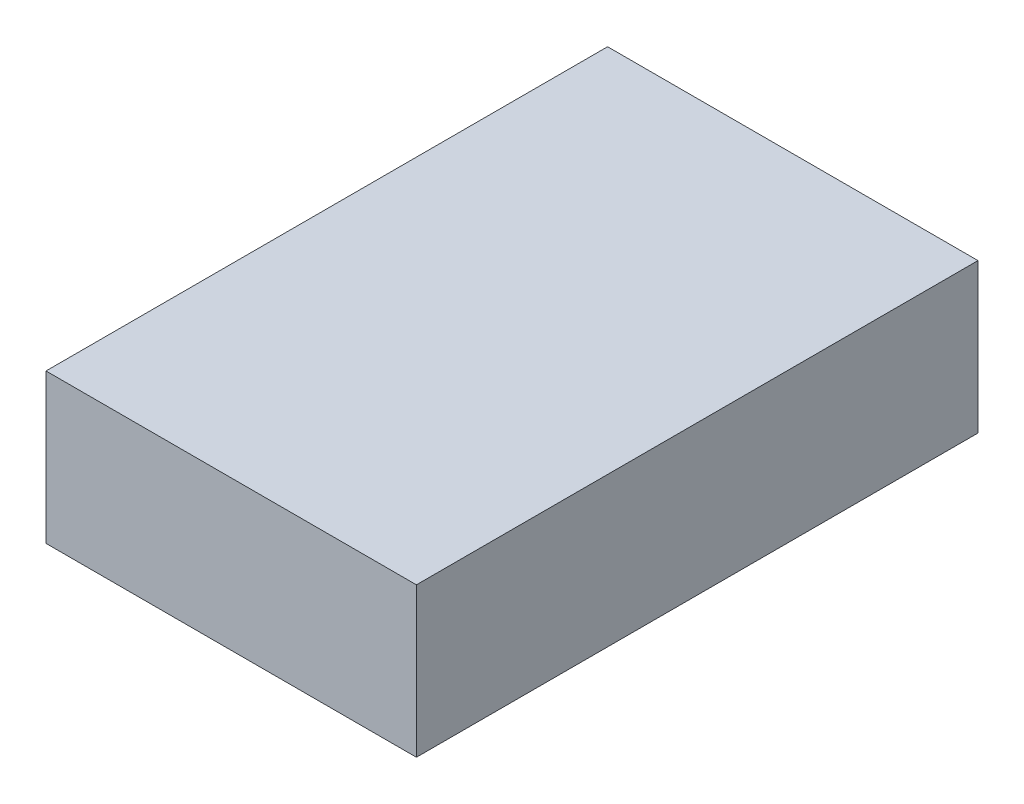
ISO-10303-21;
HEADER;
FILE_DESCRIPTION(('STEP AP214'),'2;1');
FILE_NAME('part.step','',(''),(''),'','','');
FILE_SCHEMA(('AUTOMOTIVE_DESIGN { 1 0 10303 214 1 1 1 1 }'));
ENDSEC;
DATA;
#1=APPLICATION_CONTEXT('core data for automotive mechanical design processes');
#2=APPLICATION_PROTOCOL_DEFINITION('international standard','automotive_design',2000,#1);
#3=PRODUCT_CONTEXT('',#1,'mechanical');
#4=PRODUCT('Part','Part','',(#3));
#5=PRODUCT_RELATED_PRODUCT_CATEGORY('part','',(#4));
#6=PRODUCT_DEFINITION_FORMATION('','',#4);
#7=PRODUCT_DEFINITION_CONTEXT('part definition',#1,'design');
#8=PRODUCT_DEFINITION('design','',#6,#7);
#9=PRODUCT_DEFINITION_SHAPE('','',#8);
#10=(LENGTH_UNIT() NAMED_UNIT(*) SI_UNIT(.MILLI.,.METRE.));
#11=(NAMED_UNIT(*) PLANE_ANGLE_UNIT() SI_UNIT($,.RADIAN.));
#12=(NAMED_UNIT(*) SI_UNIT($,.STERADIAN.) SOLID_ANGLE_UNIT());
#13=UNCERTAINTY_MEASURE_WITH_UNIT(LENGTH_MEASURE(1.E-05),#10,'distance_accuracy_value','');
#14=(GEOMETRIC_REPRESENTATION_CONTEXT(3) GLOBAL_UNCERTAINTY_ASSIGNED_CONTEXT((#13)) GLOBAL_UNIT_ASSIGNED_CONTEXT((#10,
#11,#12)) REPRESENTATION_CONTEXT('',''));
#15=CARTESIAN_POINT('',(0.,0.,0.));
#16=DIRECTION('',(0.,0.,1.));
#17=DIRECTION('',(1.,0.,0.));
#18=AXIS2_PLACEMENT_3D('',#15,#16,#17);
#19=CARTESIAN_POINT('',(31.,25.,47.));
#20=DIRECTION('',(-1.,0.,0.));
#21=DIRECTION('',(0.,0.,1.));
#22=AXIS2_PLACEMENT_3D('',#19,#20,#21);
#23=PLANE('',#22);
#24=DIRECTION('',(0.,0.,-1.));
#25=VECTOR('',#24,1.);
#26=CARTESIAN_POINT('',(31.,0.,47.));
#27=LINE('',#26,#25);
#28=CARTESIAN_POINT('',(31.,0.,47.));
#29=VERTEX_POINT('',#28);
#30=CARTESIAN_POINT('',(31.,0.,-47.));
#31=VERTEX_POINT('',#30);
#32=EDGE_CURVE('E107',#29,#31,#27,.T.);
#33=ORIENTED_EDGE('',*,*,#32,.T.);
#34=DIRECTION('',(0.,-1.,0.));
#35=VECTOR('',#34,1.);
#36=CARTESIAN_POINT('',(31.,25.,-47.));
#37=LINE('',#36,#35);
#38=CARTESIAN_POINT('',(31.,25.,-47.));
#39=VERTEX_POINT('',#38);
#40=EDGE_CURVE('E11',#39,#31,#37,.T.);
#41=ORIENTED_EDGE('',*,*,#40,.F.);
#42=DIRECTION('',(0.,0.,-1.));
#43=VECTOR('',#42,1.);
#44=CARTESIAN_POINT('',(31.,25.,47.));
#45=LINE('',#44,#43);
#46=CARTESIAN_POINT('',(31.,25.,47.));
#47=VERTEX_POINT('',#46);
#48=EDGE_CURVE('E91',#47,#39,#45,.T.);
#49=ORIENTED_EDGE('',*,*,#48,.F.);
#50=DIRECTION('',(0.,-1.,0.));
#51=VECTOR('',#50,1.);
#52=CARTESIAN_POINT('',(31.,25.,47.));
#53=LINE('',#52,#51);
#54=EDGE_CURVE('E103',#47,#29,#53,.T.);
#55=ORIENTED_EDGE('',*,*,#54,.T.);
#56=EDGE_LOOP('',(#33,#41,#49,#55));
#57=FACE_BOUND('',#56,.T.);
#58=ADVANCED_FACE('F39',(#57),#23,.F.);
#59=CARTESIAN_POINT('',(-31.,25.,-47.));
#60=DIRECTION('',(0.,0.,1.));
#61=DIRECTION('',(1.,0.,0.));
#62=AXIS2_PLACEMENT_3D('',#59,#60,#61);
#63=PLANE('',#62);
#64=DIRECTION('',(-1.,0.,0.));
#65=VECTOR('',#64,1.);
#66=CARTESIAN_POINT('',(-31.,0.,-47.));
#67=LINE('',#66,#65);
#68=CARTESIAN_POINT('',(-31.,0.,-47.));
#69=VERTEX_POINT('',#68);
#70=EDGE_CURVE('E96',#31,#69,#67,.T.);
#71=ORIENTED_EDGE('',*,*,#70,.T.);
#72=DIRECTION('',(0.,-1.,0.));
#73=VECTOR('',#72,1.);
#74=CARTESIAN_POINT('',(-31.,25.,-47.));
#75=LINE('',#74,#73);
#76=CARTESIAN_POINT('',(-31.,25.,-47.));
#77=VERTEX_POINT('',#76);
#78=EDGE_CURVE('E48',#77,#69,#75,.T.);
#79=ORIENTED_EDGE('',*,*,#78,.F.);
#80=DIRECTION('',(-1.,0.,0.));
#81=VECTOR('',#80,1.);
#82=CARTESIAN_POINT('',(-31.,25.,-47.));
#83=LINE('',#82,#81);
#84=EDGE_CURVE('E86',#39,#77,#83,.T.);
#85=ORIENTED_EDGE('',*,*,#84,.F.);
#86=ORIENTED_EDGE('',*,*,#40,.T.);
#87=EDGE_LOOP('',(#71,#79,#85,#86));
#88=FACE_BOUND('',#87,.T.);
#89=ADVANCED_FACE('F95',(#88),#63,.F.);
#90=CARTESIAN_POINT('',(-31.,25.,47.));
#91=DIRECTION('',(1.,0.,0.));
#92=DIRECTION('',(0.,0.,-1.));
#93=AXIS2_PLACEMENT_3D('',#90,#91,#92);
#94=PLANE('',#93);
#95=DIRECTION('',(0.,0.,1.));
#96=VECTOR('',#95,1.);
#97=CARTESIAN_POINT('',(-31.,0.,47.));
#98=LINE('',#97,#96);
#99=CARTESIAN_POINT('',(-31.,0.,47.));
#100=VERTEX_POINT('',#99);
#101=EDGE_CURVE('E73',#69,#100,#98,.T.);
#102=ORIENTED_EDGE('',*,*,#101,.T.);
#103=DIRECTION('',(0.,-1.,0.));
#104=VECTOR('',#103,1.);
#105=CARTESIAN_POINT('',(-31.,25.,47.));
#106=LINE('',#105,#104);
#107=CARTESIAN_POINT('',(-31.,25.,47.));
#108=VERTEX_POINT('',#107);
#109=EDGE_CURVE('E98',#108,#100,#106,.T.);
#110=ORIENTED_EDGE('',*,*,#109,.F.);
#111=DIRECTION('',(0.,0.,1.));
#112=VECTOR('',#111,1.);
#113=CARTESIAN_POINT('',(-31.,25.,47.));
#114=LINE('',#113,#112);
#115=EDGE_CURVE('E89',#77,#108,#114,.T.);
#116=ORIENTED_EDGE('',*,*,#115,.F.);
#117=ORIENTED_EDGE('',*,*,#78,.T.);
#118=EDGE_LOOP('',(#102,#110,#116,#117));
#119=FACE_BOUND('',#118,.T.);
#120=ADVANCED_FACE('F99',(#119),#94,.F.);
#121=CARTESIAN_POINT('',(-31.,25.,47.));
#122=DIRECTION('',(0.,0.,-1.));
#123=DIRECTION('',(-1.,0.,0.));
#124=AXIS2_PLACEMENT_3D('',#121,#122,#123);
#125=PLANE('',#124);
#126=DIRECTION('',(1.,0.,0.));
#127=VECTOR('',#126,1.);
#128=CARTESIAN_POINT('',(-31.,0.,47.));
#129=LINE('',#128,#127);
#130=EDGE_CURVE('E79',#100,#29,#129,.T.);
#131=ORIENTED_EDGE('',*,*,#130,.T.);
#132=ORIENTED_EDGE('',*,*,#54,.F.);
#133=DIRECTION('',(1.,0.,0.));
#134=VECTOR('',#133,1.);
#135=CARTESIAN_POINT('',(-31.,25.,47.));
#136=LINE('',#135,#134);
#137=EDGE_CURVE('E56',#108,#47,#136,.T.);
#138=ORIENTED_EDGE('',*,*,#137,.F.);
#139=ORIENTED_EDGE('',*,*,#109,.T.);
#140=EDGE_LOOP('',(#131,#132,#138,#139));
#141=FACE_BOUND('',#140,.T.);
#142=ADVANCED_FACE('F120',(#141),#125,.F.);
#143=CARTESIAN_POINT('',(0.,25.,0.));
#144=DIRECTION('',(0.,-1.,0.));
#145=DIRECTION('',(0.,0.,-1.));
#146=AXIS2_PLACEMENT_3D('',#143,#144,#145);
#147=PLANE('',#146);
#148=ORIENTED_EDGE('',*,*,#48,.T.);
#149=ORIENTED_EDGE('',*,*,#84,.T.);
#150=ORIENTED_EDGE('',*,*,#115,.T.);
#151=ORIENTED_EDGE('',*,*,#137,.T.);
#152=EDGE_LOOP('',(#148,#149,#150,#151));
#153=FACE_BOUND('',#152,.T.);
#154=ADVANCED_FACE('F87',(#153),#147,.F.);
#155=CARTESIAN_POINT('',(0.,0.,0.));
#156=DIRECTION('',(0.,-1.,0.));
#157=DIRECTION('',(0.,0.,-1.));
#158=AXIS2_PLACEMENT_3D('',#155,#156,#157);
#159=PLANE('',#158);
#160=ORIENTED_EDGE('',*,*,#32,.F.);
#161=ORIENTED_EDGE('',*,*,#130,.F.);
#162=ORIENTED_EDGE('',*,*,#101,.F.);
#163=ORIENTED_EDGE('',*,*,#70,.F.);
#164=EDGE_LOOP('',(#160,#161,#162,#163));
#165=FACE_BOUND('',#164,.T.);
#166=ADVANCED_FACE('F123',(#165),#159,.T.);
#167=CLOSED_SHELL('',(#58,#89,#120,#142,#154,#166));
#168=MANIFOLD_SOLID_BREP('B2',#167);
#169=ADVANCED_BREP_SHAPE_REPRESENTATION('',(#18,#168),#14);
#170=SHAPE_DEFINITION_REPRESENTATION(#9,#169);
ENDSEC;
END-ISO-10303-21;
